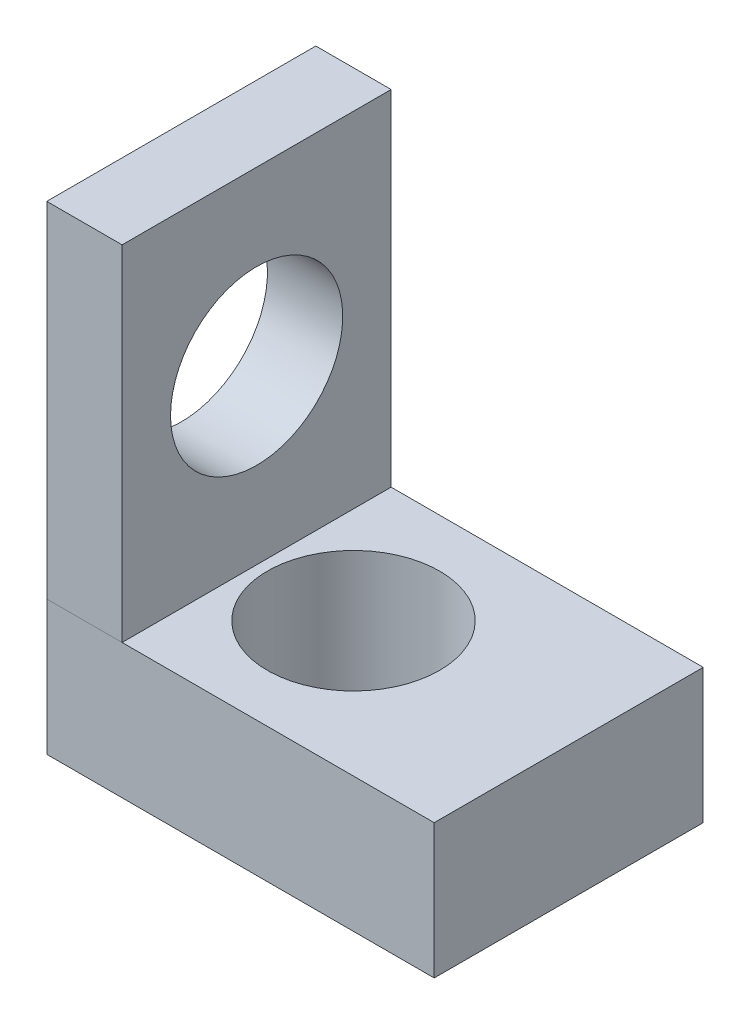
ISO-10303-21;
HEADER;
FILE_DESCRIPTION(('STEP AP214'),'2;1');
FILE_NAME('part.step','',(''),(''),'','','');
FILE_SCHEMA(('AUTOMOTIVE_DESIGN { 1 0 10303 214 1 1 1 1 }'));
ENDSEC;
DATA;
#1=APPLICATION_CONTEXT('core data for automotive mechanical design processes');
#2=APPLICATION_PROTOCOL_DEFINITION('international standard','automotive_design',2000,#1);
#3=PRODUCT_CONTEXT('',#1,'mechanical');
#4=PRODUCT('Part','Part','',(#3));
#5=PRODUCT_RELATED_PRODUCT_CATEGORY('part','',(#4));
#6=PRODUCT_DEFINITION_FORMATION('','',#4);
#7=PRODUCT_DEFINITION_CONTEXT('part definition',#1,'design');
#8=PRODUCT_DEFINITION('design','',#6,#7);
#9=PRODUCT_DEFINITION_SHAPE('','',#8);
#10=(LENGTH_UNIT() NAMED_UNIT(*) SI_UNIT(.MILLI.,.METRE.));
#11=(NAMED_UNIT(*) PLANE_ANGLE_UNIT() SI_UNIT($,.RADIAN.));
#12=(NAMED_UNIT(*) SI_UNIT($,.STERADIAN.) SOLID_ANGLE_UNIT());
#13=UNCERTAINTY_MEASURE_WITH_UNIT(LENGTH_MEASURE(1.E-05),#10,'distance_accuracy_value','');
#14=(GEOMETRIC_REPRESENTATION_CONTEXT(3) GLOBAL_UNCERTAINTY_ASSIGNED_CONTEXT((#13)) GLOBAL_UNIT_ASSIGNED_CONTEXT((#10,
#11,#12)) REPRESENTATION_CONTEXT('',''));
#15=CARTESIAN_POINT('',(0.,0.,0.));
#16=DIRECTION('',(0.,0.,1.));
#17=DIRECTION('',(1.,0.,0.));
#18=AXIS2_PLACEMENT_3D('',#15,#16,#17);
#19=CARTESIAN_POINT('',(3.31980803235464,4.97863349612241,3.35676462595567));
#20=DIRECTION('',(-1.,0.,0.));
#21=DIRECTION('',(0.,0.,-1.));
#22=AXIS2_PLACEMENT_3D('',#19,#20,#21);
#23=PLANE('',#22);
#24=CARTESIAN_POINT('',(3.31980803235467,9.04263349612238,6.53176462595572));
#25=DIRECTION('',(1.,0.,0.));
#26=DIRECTION('',(0.,0.,1.));
#27=AXIS2_PLACEMENT_3D('',#24,#25,#26);
#28=CIRCLE('',#27,2.032);
#29=CARTESIAN_POINT('',(3.31980803235467,9.04263349612236,8.56376462595572));
#30=VERTEX_POINT('',#29);
#31=EDGE_CURVE('P0_E93',#30,#30,#28,.T.);
#32=ORIENTED_EDGE('',*,*,#31,.F.);
#33=EDGE_LOOP('',(#32));
#34=FACE_BOUND('',#33,.T.);
#35=DIRECTION('',(0.,0.,1.));
#36=VECTOR('',#35,1.);
#37=CARTESIAN_POINT('',(3.3198080323547,13.1066334961224,3.35676462595576));
#38=LINE('',#37,#36);
#39=CARTESIAN_POINT('',(3.3198080323547,13.1066334961224,3.35676462595576));
#40=VERTEX_POINT('',#39);
#41=CARTESIAN_POINT('',(3.3198080323547,13.1066334961223,9.70676462595576));
#42=VERTEX_POINT('',#41);
#43=EDGE_CURVE('P0_E79',#40,#42,#38,.T.);
#44=ORIENTED_EDGE('',*,*,#43,.T.);
#45=DIRECTION('',(0.,1.,0.));
#46=VECTOR('',#45,1.);
#47=CARTESIAN_POINT('',(3.31980803235464,4.97863349612235,9.70676462595568));
#48=LINE('',#47,#46);
#49=CARTESIAN_POINT('',(3.31980803235464,4.97863349612235,9.70676462595568));
#50=VERTEX_POINT('',#49);
#51=EDGE_CURVE('P0_E10',#50,#42,#48,.T.);
#52=ORIENTED_EDGE('',*,*,#51,.F.);
#53=DIRECTION('',(0.,0.,1.));
#54=VECTOR('',#53,1.);
#55=CARTESIAN_POINT('',(3.31980803235464,4.97863349612241,3.35676462595567));
#56=LINE('',#55,#54);
#57=CARTESIAN_POINT('',(3.31980803235464,4.97863349612241,3.35676462595567));
#58=VERTEX_POINT('',#57);
#59=EDGE_CURVE('P0_E67',#58,#50,#56,.T.);
#60=ORIENTED_EDGE('',*,*,#59,.F.);
#61=DIRECTION('',(0.,1.,0.));
#62=VECTOR('',#61,1.);
#63=CARTESIAN_POINT('',(3.31980803235464,4.97863349612241,3.35676462595567));
#64=LINE('',#63,#62);
#65=EDGE_CURVE('P0_E75',#58,#40,#64,.T.);
#66=ORIENTED_EDGE('',*,*,#65,.T.);
#67=EDGE_LOOP('',(#44,#52,#60,#66));
#68=FACE_BOUND('',#67,.T.);
#69=ADVANCED_FACE('P0_F16',(#34,#68),#23,.F.);
#70=CARTESIAN_POINT('',(3.31980803235464,4.97863349612235,9.70676462595568));
#71=DIRECTION('',(0.,0.,-1.));
#72=DIRECTION('',(1.,0.,0.));
#73=AXIS2_PLACEMENT_3D('',#70,#71,#72);
#74=PLANE('',#73);
#75=DIRECTION('',(-1.,0.,0.));
#76=VECTOR('',#75,1.);
#77=CARTESIAN_POINT('',(3.3198080323547,13.1066334961223,9.70676462595576));
#78=LINE('',#77,#76);
#79=CARTESIAN_POINT('',(1.5418080323547,13.1066334961224,9.70676462595576));
#80=VERTEX_POINT('',#79);
#81=EDGE_CURVE('P0_E71',#42,#80,#78,.T.);
#82=ORIENTED_EDGE('',*,*,#81,.T.);
#83=DIRECTION('',(0.,1.,0.));
#84=VECTOR('',#83,1.);
#85=CARTESIAN_POINT('',(1.54180803235464,4.97863349612236,9.70676462595567));
#86=LINE('',#85,#84);
#87=CARTESIAN_POINT('',(1.54180803235464,4.97863349612236,9.70676462595567));
#88=VERTEX_POINT('',#87);
#89=EDGE_CURVE('P0_E24',#88,#80,#86,.T.);
#90=ORIENTED_EDGE('',*,*,#89,.F.);
#91=DIRECTION('',(-1.,0.,0.));
#92=VECTOR('',#91,1.);
#93=CARTESIAN_POINT('',(3.31980803235464,4.97863349612235,9.70676462595568));
#94=LINE('',#93,#92);
#95=EDGE_CURVE('P0_E62',#50,#88,#94,.T.);
#96=ORIENTED_EDGE('',*,*,#95,.F.);
#97=ORIENTED_EDGE('',*,*,#51,.T.);
#98=EDGE_LOOP('',(#82,#90,#96,#97));
#99=FACE_BOUND('',#98,.T.);
#100=ADVANCED_FACE('P0_F70',(#99),#74,.F.);
#101=CARTESIAN_POINT('',(1.54180803235464,4.97863349612243,3.35676462595567));
#102=DIRECTION('',(1.,0.,0.));
#103=DIRECTION('',(0.,0.,1.));
#104=AXIS2_PLACEMENT_3D('',#101,#102,#103);
#105=PLANE('',#104);
#106=CARTESIAN_POINT('',(1.54180803235467,9.04263349612239,6.53176462595572));
#107=DIRECTION('',(1.,0.,0.));
#108=DIRECTION('',(0.,0.,1.));
#109=AXIS2_PLACEMENT_3D('',#106,#107,#108);
#110=CIRCLE('',#109,2.032);
#111=CARTESIAN_POINT('',(1.54180803235467,9.04263349612237,8.56376462595572));
#112=VERTEX_POINT('',#111);
#113=EDGE_CURVE('P0_E82',#112,#112,#110,.T.);
#114=ORIENTED_EDGE('',*,*,#113,.T.);
#115=EDGE_LOOP('',(#114));
#116=FACE_BOUND('',#115,.T.);
#117=DIRECTION('',(0.,0.,-1.));
#118=VECTOR('',#117,1.);
#119=CARTESIAN_POINT('',(1.5418080323547,13.1066334961224,3.35676462595576));
#120=LINE('',#119,#118);
#121=CARTESIAN_POINT('',(1.5418080323547,13.1066334961224,3.35676462595576));
#122=VERTEX_POINT('',#121);
#123=EDGE_CURVE('P0_E49',#80,#122,#120,.T.);
#124=ORIENTED_EDGE('',*,*,#123,.T.);
#125=DIRECTION('',(0.,1.,0.));
#126=VECTOR('',#125,1.);
#127=CARTESIAN_POINT('',(1.54180803235464,4.97863349612243,3.35676462595567));
#128=LINE('',#127,#126);
#129=CARTESIAN_POINT('',(1.54180803235464,4.97863349612243,3.35676462595567));
#130=VERTEX_POINT('',#129);
#131=EDGE_CURVE('P0_E72',#130,#122,#128,.T.);
#132=ORIENTED_EDGE('',*,*,#131,.F.);
#133=DIRECTION('',(0.,0.,-1.));
#134=VECTOR('',#133,1.);
#135=CARTESIAN_POINT('',(1.54180803235464,4.97863349612243,3.35676462595567));
#136=LINE('',#135,#134);
#137=EDGE_CURVE('P0_E65',#88,#130,#136,.T.);
#138=ORIENTED_EDGE('',*,*,#137,.F.);
#139=ORIENTED_EDGE('',*,*,#89,.T.);
#140=EDGE_LOOP('',(#124,#132,#138,#139));
#141=FACE_BOUND('',#140,.T.);
#142=ADVANCED_FACE('P0_F73',(#116,#141),#105,.F.);
#143=CARTESIAN_POINT('',(3.31980803235464,4.97863349612241,3.35676462595567));
#144=DIRECTION('',(0.,0.,1.));
#145=DIRECTION('',(0.,1.,0.));
#146=AXIS2_PLACEMENT_3D('',#143,#144,#145);
#147=PLANE('',#146);
#148=DIRECTION('',(1.,0.,0.));
#149=VECTOR('',#148,1.);
#150=CARTESIAN_POINT('',(3.3198080323547,13.1066334961224,3.35676462595576));
#151=LINE('',#150,#149);
#152=EDGE_CURVE('P0_E55',#122,#40,#151,.T.);
#153=ORIENTED_EDGE('',*,*,#152,.T.);
#154=ORIENTED_EDGE('',*,*,#65,.F.);
#155=DIRECTION('',(1.,0.,0.));
#156=VECTOR('',#155,1.);
#157=CARTESIAN_POINT('',(3.31980803235464,4.97863349612241,3.35676462595567));
#158=LINE('',#157,#156);
#159=EDGE_CURVE('P0_E32',#130,#58,#158,.T.);
#160=ORIENTED_EDGE('',*,*,#159,.F.);
#161=ORIENTED_EDGE('',*,*,#131,.T.);
#162=EDGE_LOOP('',(#153,#154,#160,#161));
#163=FACE_BOUND('',#162,.T.);
#164=ADVANCED_FACE('P0_F87',(#163),#147,.F.);
#165=CARTESIAN_POINT('',(3.31980803235464,4.97863349612241,3.35676462595567));
#166=DIRECTION('',(0.,-1.,0.));
#167=DIRECTION('',(-1.,0.,0.));
#168=AXIS2_PLACEMENT_3D('',#165,#166,#167);
#169=PLANE('',#168);
#170=ORIENTED_EDGE('',*,*,#59,.T.);
#171=ORIENTED_EDGE('',*,*,#95,.T.);
#172=ORIENTED_EDGE('',*,*,#137,.T.);
#173=ORIENTED_EDGE('',*,*,#159,.T.);
#174=EDGE_LOOP('',(#170,#171,#172,#173));
#175=FACE_BOUND('',#174,.T.);
#176=ADVANCED_FACE('P0_F63',(#175),#169,.T.);
#177=CARTESIAN_POINT('',(3.3198080323547,13.1066334961224,3.35676462595576));
#178=DIRECTION('',(0.,-1.,0.));
#179=DIRECTION('',(-1.,0.,0.));
#180=AXIS2_PLACEMENT_3D('',#177,#178,#179);
#181=PLANE('',#180);
#182=ORIENTED_EDGE('',*,*,#43,.F.);
#183=ORIENTED_EDGE('',*,*,#152,.F.);
#184=ORIENTED_EDGE('',*,*,#123,.F.);
#185=ORIENTED_EDGE('',*,*,#81,.F.);
#186=EDGE_LOOP('',(#182,#183,#184,#185));
#187=FACE_BOUND('',#186,.T.);
#188=ADVANCED_FACE('P0_F90',(#187),#181,.F.);
#189=CARTESIAN_POINT('',(1.54180803235467,9.04263349612239,6.53176462595572));
#190=DIRECTION('',(1.,0.,0.));
#191=DIRECTION('',(0.,0.,1.));
#192=AXIS2_PLACEMENT_3D('',#189,#190,#191);
#193=CYLINDRICAL_SURFACE('',#192,2.032);
#194=ORIENTED_EDGE('',*,*,#113,.F.);
#195=EDGE_LOOP('',(#194));
#196=FACE_BOUND('',#195,.T.);
#197=ORIENTED_EDGE('',*,*,#31,.T.);
#198=EDGE_LOOP('',(#197));
#199=FACE_BOUND('',#198,.T.);
#200=ADVANCED_FACE('P0_F100',(#196,#199),#193,.F.);
#201=CLOSED_SHELL('',(#69,#100,#142,#164,#176,#188,#200));
#202=MANIFOLD_SOLID_BREP('P0_B1',#201);
#203=CARTESIAN_POINT('',(1.54180803235458,1.80363349612252,9.70676462595561));
#204=DIRECTION('',(0.,-1.,0.));
#205=DIRECTION('',(1.,0.,0.));
#206=AXIS2_PLACEMENT_3D('',#203,#204,#205);
#207=PLANE('',#206);
#208=DIRECTION('',(0.,0.,-1.));
#209=VECTOR('',#208,1.);
#210=CARTESIAN_POINT('',(1.54180803235458,1.80363349612252,9.70676462595561));
#211=LINE('',#210,#209);
#212=CARTESIAN_POINT('',(1.54180803235458,1.80363349612252,9.70676462595561));
#213=VERTEX_POINT('',#212);
#214=CARTESIAN_POINT('',(1.54180803235458,1.80363349612249,3.35676462595561));
#215=VERTEX_POINT('',#214);
#216=EDGE_CURVE('P1_E69',#213,#215,#211,.T.);
#217=ORIENTED_EDGE('',*,*,#216,.T.);
#218=DIRECTION('',(1.,0.,0.));
#219=VECTOR('',#218,1.);
#220=CARTESIAN_POINT('',(1.54180803235458,1.80363349612249,3.35676462595561));
#221=LINE('',#220,#219);
#222=CARTESIAN_POINT('',(10.6858080323546,1.80363349612262,3.35676462595561));
#223=VERTEX_POINT('',#222);
#224=EDGE_CURVE('P1_E64',#215,#223,#221,.T.);
#225=ORIENTED_EDGE('',*,*,#224,.T.);
#226=DIRECTION('',(0.,0.,1.));
#227=VECTOR('',#226,1.);
#228=CARTESIAN_POINT('',(10.6858080323546,1.80363349612264,9.70676462595561));
#229=LINE('',#228,#227);
#230=CARTESIAN_POINT('',(10.6858080323546,1.80363349612264,9.70676462595561));
#231=VERTEX_POINT('',#230);
#232=EDGE_CURVE('P1_E67',#223,#231,#229,.T.);
#233=ORIENTED_EDGE('',*,*,#232,.T.);
#234=DIRECTION('',(-1.,0.,0.));
#235=VECTOR('',#234,1.);
#236=CARTESIAN_POINT('',(1.54180803235458,1.80363349612252,9.70676462595561));
#237=LINE('',#236,#235);
#238=EDGE_CURVE('P1_E34',#231,#213,#237,.T.);
#239=ORIENTED_EDGE('',*,*,#238,.T.);
#240=EDGE_LOOP('',(#217,#225,#233,#239));
#241=FACE_BOUND('',#240,.T.);
#242=CARTESIAN_POINT('',(5.60580803235458,1.80363349612256,6.53176462595561));
#243=DIRECTION('',(0.,-1.,0.));
#244=DIRECTION('',(1.,0.,0.));
#245=AXIS2_PLACEMENT_3D('',#242,#243,#244);
#246=CIRCLE('',#245,2.032);
#247=CARTESIAN_POINT('',(7.63780803235458,1.80363349612259,6.53176462595561));
#248=VERTEX_POINT('',#247);
#249=EDGE_CURVE('P1_E84',#248,#248,#246,.T.);
#250=ORIENTED_EDGE('',*,*,#249,.F.);
#251=EDGE_LOOP('',(#250));
#252=FACE_BOUND('',#251,.T.);
#253=ADVANCED_FACE('P1_F17',(#241,#252),#207,.T.);
#254=CARTESIAN_POINT('',(1.54180803235454,4.97863349612251,9.7067646259556));
#255=DIRECTION('',(0.,-1.,0.));
#256=DIRECTION('',(1.,0.,0.));
#257=AXIS2_PLACEMENT_3D('',#254,#255,#256);
#258=PLANE('',#257);
#259=DIRECTION('',(0.,0.,-1.));
#260=VECTOR('',#259,1.);
#261=CARTESIAN_POINT('',(1.54180803235454,4.97863349612251,9.7067646259556));
#262=LINE('',#261,#260);
#263=CARTESIAN_POINT('',(1.54180803235454,4.97863349612251,9.7067646259556));
#264=VERTEX_POINT('',#263);
#265=CARTESIAN_POINT('',(1.54180803235454,4.97863349612249,3.3567646259556));
#266=VERTEX_POINT('',#265);
#267=EDGE_CURVE('P1_E81',#264,#266,#262,.T.);
#268=ORIENTED_EDGE('',*,*,#267,.F.);
#269=DIRECTION('',(-1.,0.,0.));
#270=VECTOR('',#269,1.);
#271=CARTESIAN_POINT('',(1.54180803235454,4.97863349612251,9.7067646259556));
#272=LINE('',#271,#270);
#273=CARTESIAN_POINT('',(10.6858080323545,4.97863349612264,9.7067646259556));
#274=VERTEX_POINT('',#273);
#275=EDGE_CURVE('P1_E57',#274,#264,#272,.T.);
#276=ORIENTED_EDGE('',*,*,#275,.F.);
#277=DIRECTION('',(0.,0.,1.));
#278=VECTOR('',#277,1.);
#279=CARTESIAN_POINT('',(10.6858080323545,4.97863349612264,9.7067646259556));
#280=LINE('',#279,#278);
#281=CARTESIAN_POINT('',(10.6858080323545,4.97863349612262,3.3567646259556));
#282=VERTEX_POINT('',#281);
#283=EDGE_CURVE('P1_E51',#282,#274,#280,.T.);
#284=ORIENTED_EDGE('',*,*,#283,.F.);
#285=DIRECTION('',(1.,0.,0.));
#286=VECTOR('',#285,1.);
#287=CARTESIAN_POINT('',(1.54180803235454,4.97863349612249,3.3567646259556));
#288=LINE('',#287,#286);
#289=EDGE_CURVE('P1_E73',#266,#282,#288,.T.);
#290=ORIENTED_EDGE('',*,*,#289,.F.);
#291=EDGE_LOOP('',(#268,#276,#284,#290));
#292=FACE_BOUND('',#291,.T.);
#293=CARTESIAN_POINT('',(5.60580803235454,4.97863349612256,6.5317646259556));
#294=DIRECTION('',(0.,-1.,0.));
#295=DIRECTION('',(1.,0.,0.));
#296=AXIS2_PLACEMENT_3D('',#293,#294,#295);
#297=CIRCLE('',#296,2.032);
#298=CARTESIAN_POINT('',(7.63780803235453,4.97863349612259,6.5317646259556));
#299=VERTEX_POINT('',#298);
#300=EDGE_CURVE('P1_E96',#299,#299,#297,.T.);
#301=ORIENTED_EDGE('',*,*,#300,.T.);
#302=EDGE_LOOP('',(#301));
#303=FACE_BOUND('',#302,.T.);
#304=ADVANCED_FACE('P1_F92',(#292,#303),#258,.F.);
#305=CARTESIAN_POINT('',(1.54180803235458,1.80363349612252,9.70676462595561));
#306=DIRECTION('',(1.,0.,0.));
#307=DIRECTION('',(0.,0.,1.));
#308=AXIS2_PLACEMENT_3D('',#305,#306,#307);
#309=PLANE('',#308);
#310=ORIENTED_EDGE('',*,*,#267,.T.);
#311=DIRECTION('',(0.,1.,0.));
#312=VECTOR('',#311,1.);
#313=CARTESIAN_POINT('',(1.54180803235458,1.80363349612249,3.35676462595561));
#314=LINE('',#313,#312);
#315=EDGE_CURVE('P1_E11',#215,#266,#314,.T.);
#316=ORIENTED_EDGE('',*,*,#315,.F.);
#317=ORIENTED_EDGE('',*,*,#216,.F.);
#318=DIRECTION('',(0.,1.,0.));
#319=VECTOR('',#318,1.);
#320=CARTESIAN_POINT('',(1.54180803235458,1.80363349612252,9.70676462595561));
#321=LINE('',#320,#319);
#322=EDGE_CURVE('P1_E77',#213,#264,#321,.T.);
#323=ORIENTED_EDGE('',*,*,#322,.T.);
#324=EDGE_LOOP('',(#310,#316,#317,#323));
#325=FACE_BOUND('',#324,.T.);
#326=ADVANCED_FACE('P1_F19',(#325),#309,.F.);
#327=CARTESIAN_POINT('',(1.54180803235458,1.80363349612249,3.35676462595561));
#328=DIRECTION('',(0.,0.,1.));
#329=DIRECTION('',(0.,-1.,0.));
#330=AXIS2_PLACEMENT_3D('',#327,#328,#329);
#331=PLANE('',#330);
#332=ORIENTED_EDGE('',*,*,#289,.T.);
#333=DIRECTION('',(0.,1.,0.));
#334=VECTOR('',#333,1.);
#335=CARTESIAN_POINT('',(10.6858080323546,1.80363349612262,3.35676462595561));
#336=LINE('',#335,#334);
#337=EDGE_CURVE('P1_E26',#223,#282,#336,.T.);
#338=ORIENTED_EDGE('',*,*,#337,.F.);
#339=ORIENTED_EDGE('',*,*,#224,.F.);
#340=ORIENTED_EDGE('',*,*,#315,.T.);
#341=EDGE_LOOP('',(#332,#338,#339,#340));
#342=FACE_BOUND('',#341,.T.);
#343=ADVANCED_FACE('P1_F72',(#342),#331,.F.);
#344=CARTESIAN_POINT('',(10.6858080323546,1.80363349612264,9.70676462595561));
#345=DIRECTION('',(-1.,0.,0.));
#346=DIRECTION('',(0.,-1.,0.));
#347=AXIS2_PLACEMENT_3D('',#344,#345,#346);
#348=PLANE('',#347);
#349=ORIENTED_EDGE('',*,*,#283,.T.);
#350=DIRECTION('',(0.,1.,0.));
#351=VECTOR('',#350,1.);
#352=CARTESIAN_POINT('',(10.6858080323546,1.80363349612264,9.70676462595561));
#353=LINE('',#352,#351);
#354=EDGE_CURVE('P1_E74',#231,#274,#353,.T.);
#355=ORIENTED_EDGE('',*,*,#354,.F.);
#356=ORIENTED_EDGE('',*,*,#232,.F.);
#357=ORIENTED_EDGE('',*,*,#337,.T.);
#358=EDGE_LOOP('',(#349,#355,#356,#357));
#359=FACE_BOUND('',#358,.T.);
#360=ADVANCED_FACE('P1_F75',(#359),#348,.F.);
#361=CARTESIAN_POINT('',(1.54180803235458,1.80363349612252,9.70676462595561));
#362=DIRECTION('',(0.,0.,-1.));
#363=DIRECTION('',(0.,1.,0.));
#364=AXIS2_PLACEMENT_3D('',#361,#362,#363);
#365=PLANE('',#364);
#366=ORIENTED_EDGE('',*,*,#275,.T.);
#367=ORIENTED_EDGE('',*,*,#322,.F.);
#368=ORIENTED_EDGE('',*,*,#238,.F.);
#369=ORIENTED_EDGE('',*,*,#354,.T.);
#370=EDGE_LOOP('',(#366,#367,#368,#369));
#371=FACE_BOUND('',#370,.T.);
#372=ADVANCED_FACE('P1_F89',(#371),#365,.F.);
#373=CARTESIAN_POINT('',(5.60580803235458,1.80363349612256,6.53176462595561));
#374=DIRECTION('',(0.,1.,0.));
#375=DIRECTION('',(-1.,0.,0.));
#376=AXIS2_PLACEMENT_3D('',#373,#374,#375);
#377=CYLINDRICAL_SURFACE('',#376,2.032);
#378=ORIENTED_EDGE('',*,*,#249,.T.);
#379=EDGE_LOOP('',(#378));
#380=FACE_BOUND('',#379,.T.);
#381=ORIENTED_EDGE('',*,*,#300,.F.);
#382=EDGE_LOOP('',(#381));
#383=FACE_BOUND('',#382,.T.);
#384=ADVANCED_FACE('P1_F102',(#380,#383),#377,.F.);
#385=CLOSED_SHELL('',(#253,#304,#326,#343,#360,#372,#384));
#386=MANIFOLD_SOLID_BREP('P1_B1',#385);
#387=ADVANCED_BREP_SHAPE_REPRESENTATION('',(#18,#202,#386),#14);
#388=SHAPE_DEFINITION_REPRESENTATION(#9,#387);
ENDSEC;
END-ISO-10303-21;
